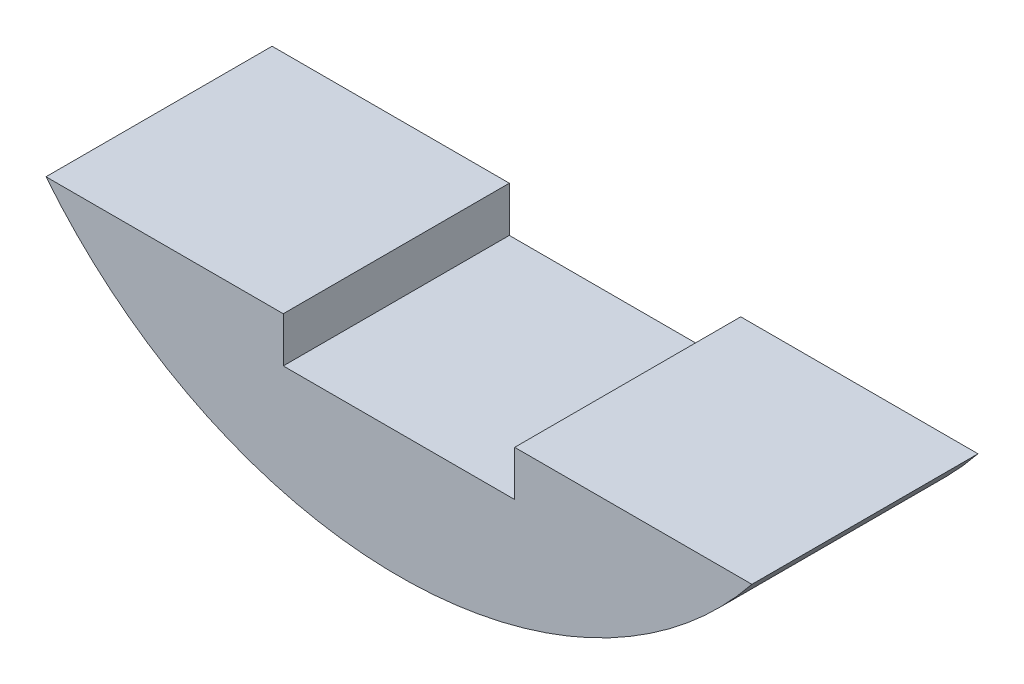
ISO-10303-21;
HEADER;
FILE_DESCRIPTION(('STEP AP214'),'2;1');
FILE_NAME('part.step','',(''),(''),'','','');
FILE_SCHEMA(('AUTOMOTIVE_DESIGN { 1 0 10303 214 1 1 1 1 }'));
ENDSEC;
DATA;
#1=APPLICATION_CONTEXT('core data for automotive mechanical design processes');
#2=APPLICATION_PROTOCOL_DEFINITION('international standard','automotive_design',2000,#1);
#3=PRODUCT_CONTEXT('',#1,'mechanical');
#4=PRODUCT('Part','Part','',(#3));
#5=PRODUCT_RELATED_PRODUCT_CATEGORY('part','',(#4));
#6=PRODUCT_DEFINITION_FORMATION('','',#4);
#7=PRODUCT_DEFINITION_CONTEXT('part definition',#1,'design');
#8=PRODUCT_DEFINITION('design','',#6,#7);
#9=PRODUCT_DEFINITION_SHAPE('','',#8);
#10=(LENGTH_UNIT() NAMED_UNIT(*) SI_UNIT(.MILLI.,.METRE.));
#11=(NAMED_UNIT(*) PLANE_ANGLE_UNIT() SI_UNIT($,.RADIAN.));
#12=(NAMED_UNIT(*) SI_UNIT($,.STERADIAN.) SOLID_ANGLE_UNIT());
#13=UNCERTAINTY_MEASURE_WITH_UNIT(LENGTH_MEASURE(1.E-05),#10,'distance_accuracy_value','');
#14=(GEOMETRIC_REPRESENTATION_CONTEXT(3) GLOBAL_UNCERTAINTY_ASSIGNED_CONTEXT((#13)) GLOBAL_UNIT_ASSIGNED_CONTEXT((#10,
#11,#12)) REPRESENTATION_CONTEXT('',''));
#15=CARTESIAN_POINT('',(0.,0.,0.));
#16=DIRECTION('',(0.,0.,1.));
#17=DIRECTION('',(1.,0.,0.));
#18=AXIS2_PLACEMENT_3D('',#15,#16,#17);
#19=CARTESIAN_POINT('',(0.,0.,25.4));
#20=DIRECTION('',(0.,-1.,0.));
#21=DIRECTION('',(0.,0.,-1.));
#22=AXIS2_PLACEMENT_3D('',#19,#20,#21);
#23=PLANE('',#22);
#24=DIRECTION('',(-1.,0.,0.));
#25=VECTOR('',#24,1.);
#26=CARTESIAN_POINT('',(0.,0.,25.4));
#27=LINE('',#26,#25);
#28=CARTESIAN_POINT('',(26.6557372898298,0.,25.4));
#29=VERTEX_POINT('',#28);
#30=CARTESIAN_POINT('',(0.,0.,25.4));
#31=VERTEX_POINT('',#30);
#32=EDGE_CURVE('E61',#29,#31,#27,.T.);
#33=ORIENTED_EDGE('',*,*,#32,.F.);
#34=DIRECTION('',(0.,0.,1.));
#35=VECTOR('',#34,1.);
#36=CARTESIAN_POINT('',(26.6557372898298,0.,0.));
#37=LINE('',#36,#35);
#38=CARTESIAN_POINT('',(26.6557372898298,0.,0.));
#39=VERTEX_POINT('',#38);
#40=EDGE_CURVE('E80',#39,#29,#37,.T.);
#41=ORIENTED_EDGE('',*,*,#40,.F.);
#42=DIRECTION('',(-1.,0.,0.));
#43=VECTOR('',#42,1.);
#44=CARTESIAN_POINT('',(0.,0.,0.));
#45=LINE('',#44,#43);
#46=CARTESIAN_POINT('',(0.,0.,0.));
#47=VERTEX_POINT('',#46);
#48=EDGE_CURVE('E75',#39,#47,#45,.T.);
#49=ORIENTED_EDGE('',*,*,#48,.T.);
#50=DIRECTION('',(0.,0.,-1.));
#51=VECTOR('',#50,1.);
#52=CARTESIAN_POINT('',(0.,0.,25.4));
#53=LINE('',#52,#51);
#54=EDGE_CURVE('E45',#31,#47,#53,.T.);
#55=ORIENTED_EDGE('',*,*,#54,.F.);
#56=EDGE_LOOP('',(#33,#41,#49,#55));
#57=FACE_BOUND('',#56,.T.);
#58=ADVANCED_FACE('F37',(#57),#23,.F.);
#59=CARTESIAN_POINT('',(39.6557372898298,31.75,25.4));
#60=DIRECTION('',(0.,0.,-1.));
#61=DIRECTION('',(-1.,0.,0.));
#62=AXIS2_PLACEMENT_3D('',#59,#60,#61);
#63=CYLINDRICAL_SURFACE('',#62,50.8);
#64=CARTESIAN_POINT('',(39.6557372898298,31.75,0.));
#65=DIRECTION('',(0.,0.,1.));
#66=DIRECTION('',(1.,0.,0.));
#67=AXIS2_PLACEMENT_3D('',#64,#65,#66);
#68=CIRCLE('',#67,50.8);
#69=CARTESIAN_POINT('',(79.3114745796597,0.,0.));
#70=VERTEX_POINT('',#69);
#71=EDGE_CURVE('E85',#47,#70,#68,.T.);
#72=ORIENTED_EDGE('',*,*,#71,.T.);
#73=DIRECTION('',(0.,0.,-1.));
#74=VECTOR('',#73,1.);
#75=CARTESIAN_POINT('',(79.3114745796597,0.,25.4));
#76=LINE('',#75,#74);
#77=CARTESIAN_POINT('',(79.3114745796597,0.,25.4));
#78=VERTEX_POINT('',#77);
#79=EDGE_CURVE('E11',#78,#70,#76,.T.);
#80=ORIENTED_EDGE('',*,*,#79,.F.);
#81=CARTESIAN_POINT('',(39.6557372898298,31.75,25.4));
#82=DIRECTION('',(0.,0.,1.));
#83=DIRECTION('',(1.,0.,0.));
#84=AXIS2_PLACEMENT_3D('',#81,#82,#83);
#85=CIRCLE('',#84,50.8);
#86=EDGE_CURVE('E90',#31,#78,#85,.T.);
#87=ORIENTED_EDGE('',*,*,#86,.F.);
#88=ORIENTED_EDGE('',*,*,#54,.T.);
#89=EDGE_LOOP('',(#72,#80,#87,#88));
#90=FACE_BOUND('',#89,.T.);
#91=ADVANCED_FACE('F39',(#90),#63,.T.);
#92=CARTESIAN_POINT('',(52.6557372898298,0.,0.));
#93=VERTEX_POINT('',#92);
#94=EDGE_CURVE('E84',#70,#93,#45,.T.);
#95=ORIENTED_EDGE('',*,*,#94,.T.);
#96=DIRECTION('',(0.,0.,-1.));
#97=VECTOR('',#96,1.);
#98=CARTESIAN_POINT('',(52.6557372898298,0.,0.));
#99=LINE('',#98,#97);
#100=CARTESIAN_POINT('',(52.6557372898298,0.,25.4));
#101=VERTEX_POINT('',#100);
#102=EDGE_CURVE('E114',#101,#93,#99,.T.);
#103=ORIENTED_EDGE('',*,*,#102,.F.);
#104=EDGE_CURVE('E91',#78,#101,#27,.T.);
#105=ORIENTED_EDGE('',*,*,#104,.F.);
#106=ORIENTED_EDGE('',*,*,#79,.T.);
#107=EDGE_LOOP('',(#95,#103,#105,#106));
#108=FACE_BOUND('',#107,.T.);
#109=ADVANCED_FACE('F141',(#108),#23,.F.);
#110=CARTESIAN_POINT('',(39.6557372898298,31.75,25.4));
#111=DIRECTION('',(0.,0.,1.));
#112=DIRECTION('',(1.,0.,0.));
#113=AXIS2_PLACEMENT_3D('',#110,#111,#112);
#114=PLANE('',#113);
#115=DIRECTION('',(0.,1.,0.));
#116=VECTOR('',#115,1.);
#117=CARTESIAN_POINT('',(26.6557372898298,-5.08,25.4));
#118=LINE('',#117,#116);
#119=CARTESIAN_POINT('',(26.6557372898298,-5.08,25.4));
#120=VERTEX_POINT('',#119);
#121=EDGE_CURVE('E107',#120,#29,#118,.T.);
#122=ORIENTED_EDGE('',*,*,#121,.T.);
#123=ORIENTED_EDGE('',*,*,#32,.T.);
#124=ORIENTED_EDGE('',*,*,#86,.T.);
#125=ORIENTED_EDGE('',*,*,#104,.T.);
#126=DIRECTION('',(0.,1.,0.));
#127=VECTOR('',#126,1.);
#128=CARTESIAN_POINT('',(52.6557372898298,-5.08,25.4));
#129=LINE('',#128,#127);
#130=CARTESIAN_POINT('',(52.6557372898298,-5.08,25.4));
#131=VERTEX_POINT('',#130);
#132=EDGE_CURVE('E109',#131,#101,#129,.T.);
#133=ORIENTED_EDGE('',*,*,#132,.F.);
#134=DIRECTION('',(1.,0.,0.));
#135=VECTOR('',#134,1.);
#136=CARTESIAN_POINT('',(26.6557372898298,-5.08,25.4));
#137=LINE('',#136,#135);
#138=EDGE_CURVE('E121',#120,#131,#137,.T.);
#139=ORIENTED_EDGE('',*,*,#138,.F.);
#140=EDGE_LOOP('',(#122,#123,#124,#125,#133,#139));
#141=FACE_BOUND('',#140,.T.);
#142=ADVANCED_FACE('F134',(#141),#114,.T.);
#143=CARTESIAN_POINT('',(39.6557372898298,31.75,0.));
#144=DIRECTION('',(0.,0.,1.));
#145=DIRECTION('',(1.,0.,0.));
#146=AXIS2_PLACEMENT_3D('',#143,#144,#145);
#147=PLANE('',#146);
#148=ORIENTED_EDGE('',*,*,#48,.F.);
#149=DIRECTION('',(0.,1.,0.));
#150=VECTOR('',#149,1.);
#151=CARTESIAN_POINT('',(26.6557372898298,-5.08,0.));
#152=LINE('',#151,#150);
#153=CARTESIAN_POINT('',(26.6557372898298,-5.08,0.));
#154=VERTEX_POINT('',#153);
#155=EDGE_CURVE('E95',#154,#39,#152,.T.);
#156=ORIENTED_EDGE('',*,*,#155,.F.);
#157=DIRECTION('',(-1.,0.,0.));
#158=VECTOR('',#157,1.);
#159=CARTESIAN_POINT('',(26.6557372898298,-5.08,0.));
#160=LINE('',#159,#158);
#161=CARTESIAN_POINT('',(52.6557372898298,-5.08,0.));
#162=VERTEX_POINT('',#161);
#163=EDGE_CURVE('E110',#162,#154,#160,.T.);
#164=ORIENTED_EDGE('',*,*,#163,.F.);
#165=DIRECTION('',(0.,1.,0.));
#166=VECTOR('',#165,1.);
#167=CARTESIAN_POINT('',(52.6557372898298,-5.08,0.));
#168=LINE('',#167,#166);
#169=EDGE_CURVE('E98',#162,#93,#168,.T.);
#170=ORIENTED_EDGE('',*,*,#169,.T.);
#171=ORIENTED_EDGE('',*,*,#94,.F.);
#172=ORIENTED_EDGE('',*,*,#71,.F.);
#173=EDGE_LOOP('',(#148,#156,#164,#170,#171,#172));
#174=FACE_BOUND('',#173,.T.);
#175=ADVANCED_FACE('F92',(#174),#147,.F.);
#176=CARTESIAN_POINT('',(26.6557372898298,-5.08,0.));
#177=DIRECTION('',(-1.,0.,0.));
#178=DIRECTION('',(0.,0.,1.));
#179=AXIS2_PLACEMENT_3D('',#176,#177,#178);
#180=PLANE('',#179);
#181=ORIENTED_EDGE('',*,*,#40,.T.);
#182=ORIENTED_EDGE('',*,*,#121,.F.);
#183=DIRECTION('',(0.,0.,1.));
#184=VECTOR('',#183,1.);
#185=CARTESIAN_POINT('',(26.6557372898298,-5.08,0.));
#186=LINE('',#185,#184);
#187=EDGE_CURVE('E117',#154,#120,#186,.T.);
#188=ORIENTED_EDGE('',*,*,#187,.F.);
#189=ORIENTED_EDGE('',*,*,#155,.T.);
#190=EDGE_LOOP('',(#181,#182,#188,#189));
#191=FACE_BOUND('',#190,.T.);
#192=ADVANCED_FACE('F174',(#191),#180,.F.);
#193=CARTESIAN_POINT('',(52.6557372898298,-5.08,0.));
#194=DIRECTION('',(1.,0.,0.));
#195=DIRECTION('',(0.,0.,-1.));
#196=AXIS2_PLACEMENT_3D('',#193,#194,#195);
#197=PLANE('',#196);
#198=ORIENTED_EDGE('',*,*,#102,.T.);
#199=ORIENTED_EDGE('',*,*,#169,.F.);
#200=DIRECTION('',(0.,0.,-1.));
#201=VECTOR('',#200,1.);
#202=CARTESIAN_POINT('',(52.6557372898298,-5.08,0.));
#203=LINE('',#202,#201);
#204=EDGE_CURVE('E52',#131,#162,#203,.T.);
#205=ORIENTED_EDGE('',*,*,#204,.F.);
#206=ORIENTED_EDGE('',*,*,#132,.T.);
#207=EDGE_LOOP('',(#198,#199,#205,#206));
#208=FACE_BOUND('',#207,.T.);
#209=ADVANCED_FACE('F139',(#208),#197,.F.);
#210=CARTESIAN_POINT('',(0.,-5.08,0.));
#211=DIRECTION('',(0.,1.,0.));
#212=DIRECTION('',(0.,0.,1.));
#213=AXIS2_PLACEMENT_3D('',#210,#211,#212);
#214=PLANE('',#213);
#215=ORIENTED_EDGE('',*,*,#187,.T.);
#216=ORIENTED_EDGE('',*,*,#138,.T.);
#217=ORIENTED_EDGE('',*,*,#204,.T.);
#218=ORIENTED_EDGE('',*,*,#163,.T.);
#219=EDGE_LOOP('',(#215,#216,#217,#218));
#220=FACE_BOUND('',#219,.T.);
#221=ADVANCED_FACE('F127',(#220),#214,.T.);
#222=CLOSED_SHELL('',(#58,#91,#109,#142,#175,#192,#209,#221));
#223=MANIFOLD_SOLID_BREP('B2',#222);
#224=ADVANCED_BREP_SHAPE_REPRESENTATION('',(#18,#223),#14);
#225=SHAPE_DEFINITION_REPRESENTATION(#9,#224);
ENDSEC;
END-ISO-10303-21;
